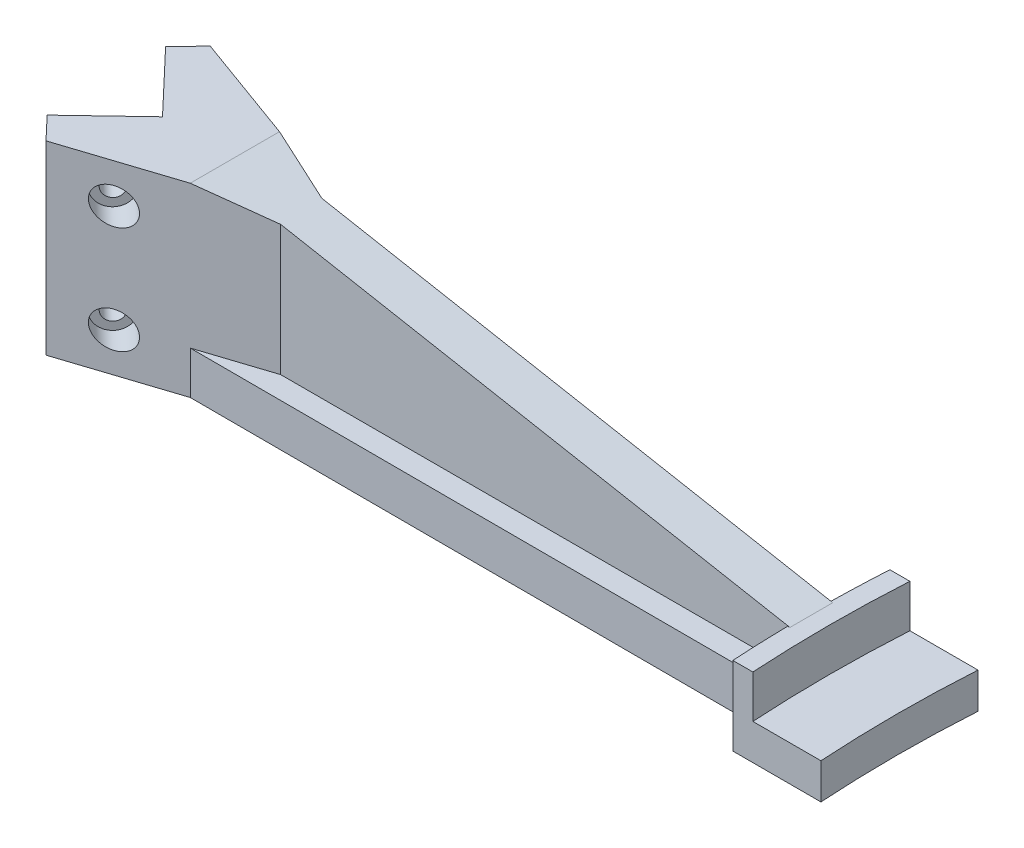
ISO-10303-21;
HEADER;
FILE_DESCRIPTION(('STEP AP214'),'2;1');
FILE_NAME('part.step','',(''),(''),'','','');
FILE_SCHEMA(('AUTOMOTIVE_DESIGN { 1 0 10303 214 1 1 1 1 }'));
ENDSEC;
DATA;
#1=APPLICATION_CONTEXT('core data for automotive mechanical design processes');
#2=APPLICATION_PROTOCOL_DEFINITION('international standard','automotive_design',2000,#1);
#3=PRODUCT_CONTEXT('',#1,'mechanical');
#4=PRODUCT('Part','Part','',(#3));
#5=PRODUCT_RELATED_PRODUCT_CATEGORY('part','',(#4));
#6=PRODUCT_DEFINITION_FORMATION('','',#4);
#7=PRODUCT_DEFINITION_CONTEXT('part definition',#1,'design');
#8=PRODUCT_DEFINITION('design','',#6,#7);
#9=PRODUCT_DEFINITION_SHAPE('','',#8);
#10=(LENGTH_UNIT() NAMED_UNIT(*) SI_UNIT(.MILLI.,.METRE.));
#11=(NAMED_UNIT(*) PLANE_ANGLE_UNIT() SI_UNIT($,.RADIAN.));
#12=(NAMED_UNIT(*) SI_UNIT($,.STERADIAN.) SOLID_ANGLE_UNIT());
#13=UNCERTAINTY_MEASURE_WITH_UNIT(LENGTH_MEASURE(1.E-05),#10,'distance_accuracy_value','');
#14=(GEOMETRIC_REPRESENTATION_CONTEXT(3) GLOBAL_UNCERTAINTY_ASSIGNED_CONTEXT((#13)) GLOBAL_UNIT_ASSIGNED_CONTEXT((#10,
#11,#12)) REPRESENTATION_CONTEXT('',''));
#15=CARTESIAN_POINT('',(0.,0.,0.));
#16=DIRECTION('',(0.,0.,1.));
#17=DIRECTION('',(1.,0.,0.));
#18=AXIS2_PLACEMENT_3D('',#15,#16,#17);
#19=CARTESIAN_POINT('',(-14.677433010329,-12.,40.4115677614171));
#20=DIRECTION('',(0.341379794654496,0.,-0.939925441618458));
#21=DIRECTION('',(0.939925441618459,0.,0.341379794654496));
#22=AXIS2_PLACEMENT_3D('',#19,#20,#21);
#23=PLANE('',#22);
#24=CARTESIAN_POINT('',(-176.366171619887,29.,-18.3135884482406));
#25=DIRECTION('',(-0.341379794654496,0.,0.939925441618458));
#26=DIRECTION('',(-0.939925441618459,0.,-0.341379794654496));
#27=AXIS2_PLACEMENT_3D('',#24,#25,#26);
#28=ELLIPSE('',#27,5.58738315295416,4.99999999999998);
#29=CARTESIAN_POINT('',(-181.617895197419,29.,-20.2210081616521));
#30=VERTEX_POINT('',#29);
#31=EDGE_CURVE('E194',#30,#30,#28,.T.);
#32=ORIENTED_EDGE('',*,*,#31,.T.);
#33=EDGE_LOOP('',(#32));
#34=FACE_BOUND('',#33,.T.);
#35=CARTESIAN_POINT('',(-176.366171619887,-0.999999999999997,-18.3135884482406));
#36=DIRECTION('',(-0.341379794654496,0.,0.939925441618458));
#37=DIRECTION('',(-0.939925441618459,0.,-0.341379794654496));
#38=AXIS2_PLACEMENT_3D('',#35,#36,#37);
#39=ELLIPSE('',#38,5.58738315295416,4.99999999999998);
#40=CARTESIAN_POINT('',(-181.617895197419,-0.999999999999997,-20.2210081616521));
#41=VERTEX_POINT('',#40);
#42=EDGE_CURVE('E329',#41,#41,#39,.T.);
#43=ORIENTED_EDGE('',*,*,#42,.T.);
#44=EDGE_LOOP('',(#43));
#45=FACE_BOUND('',#44,.T.);
#46=DIRECTION('',(0.,1.,0.));
#47=VECTOR('',#46,1.);
#48=CARTESIAN_POINT('',(-142.463007925521,-12.,-6.));
#49=LINE('',#48,#47);
#50=CARTESIAN_POINT('',(-142.463007925521,0.,-6.));
#51=VERTEX_POINT('',#50);
#52=CARTESIAN_POINT('',(-142.463007925521,36.5394166426613,-6.));
#53=VERTEX_POINT('',#52);
#54=EDGE_CURVE('E392',#51,#53,#49,.T.);
#55=ORIENTED_EDGE('',*,*,#54,.F.);
#56=DIRECTION('',(0.939925441618459,0.,0.341379794654496));
#57=VECTOR('',#56,1.);
#58=CARTESIAN_POINT('',(-14.677433010329,0.,40.4115677614171));
#59=LINE('',#58,#57);
#60=CARTESIAN_POINT('',(-161.12456554,0.,-12.7778553747776));
#61=VERTEX_POINT('',#60);
#62=EDGE_CURVE('E213',#61,#51,#59,.T.);
#63=ORIENTED_EDGE('',*,*,#62,.F.);
#64=DIRECTION('',(0.,1.,0.));
#65=VECTOR('',#64,1.);
#66=CARTESIAN_POINT('',(-161.12456554,-12.,-12.7778553747776));
#67=LINE('',#66,#65);
#68=CARTESIAN_POINT('',(-161.12456554,-12.,-12.7778553747776));
#69=VERTEX_POINT('',#68);
#70=EDGE_CURVE('E298',#69,#61,#67,.T.);
#71=ORIENTED_EDGE('',*,*,#70,.F.);
#72=DIRECTION('',(0.939925441618459,0.,0.341379794654496));
#73=VECTOR('',#72,1.);
#74=CARTESIAN_POINT('',(-14.677433010329,-12.,40.4115677614171));
#75=LINE('',#74,#73);
#76=CARTESIAN_POINT('',(-191.610767905309,-12.,-23.8504075607723));
#77=VERTEX_POINT('',#76);
#78=EDGE_CURVE('E290',#77,#69,#75,.T.);
#79=ORIENTED_EDGE('',*,*,#78,.F.);
#80=DIRECTION('',(0.,1.,0.));
#81=VECTOR('',#80,1.);
#82=CARTESIAN_POINT('',(-191.610767905309,-12.,-23.8504075607723));
#83=LINE('',#82,#81);
#84=CARTESIAN_POINT('',(-191.610767905309,40.,-23.8504075607723));
#85=VERTEX_POINT('',#84);
#86=EDGE_CURVE('E207',#77,#85,#83,.T.);
#87=ORIENTED_EDGE('',*,*,#86,.T.);
#88=DIRECTION('',(0.939925441618459,0.,0.341379794654496));
#89=VECTOR('',#88,1.);
#90=CARTESIAN_POINT('',(-14.677433010329,40.,40.4115677614171));
#91=LINE('',#90,#89);
#92=CARTESIAN_POINT('',(-161.12456554,40.,-12.7778553747775));
#93=VERTEX_POINT('',#92);
#94=EDGE_CURVE('E188',#85,#93,#91,.T.);
#95=ORIENTED_EDGE('',*,*,#94,.T.);
#96=DIRECTION('',(-0.925965204122098,0.171710199172954,-0.336309453115885));
#97=VECTOR('',#96,1.);
#98=CARTESIAN_POINT('',(-10.72745892573,12.1104885833626,41.8461936180905));
#99=LINE('',#98,#97);
#100=EDGE_CURVE('E193',#53,#93,#99,.T.);
#101=ORIENTED_EDGE('',*,*,#100,.F.);
#102=EDGE_LOOP('',(#55,#63,#71,#79,#87,#95,#101));
#103=FACE_BOUND('',#102,.T.);
#104=ADVANCED_FACE('F40',(#34,#45,#103),#23,.T.);
#105=CARTESIAN_POINT('',(-11.8491370737928,-12.,-36.3875184693806));
#106=DIRECTION('',(-0.309634199461379,0.,-0.950855752742713));
#107=DIRECTION('',(0.950855752742713,0.,-0.309634199461379));
#108=AXIS2_PLACEMENT_3D('',#105,#106,#107);
#109=PLANE('',#108);
#110=CARTESIAN_POINT('',(-177.25059753382,29.,17.4733838300045));
#111=DIRECTION('',(0.309634199461379,0.,0.950855752742713));
#112=DIRECTION('',(-0.950855752742713,0.,0.309634199461379));
#113=AXIS2_PLACEMENT_3D('',#110,#111,#112);
#114=ELLIPSE('',#113,5.68578526215447,4.99999999999998);
#115=CARTESIAN_POINT('',(-182.656959159199,29.,19.233897397961));
#116=VERTEX_POINT('',#115);
#117=EDGE_CURVE('E339',#116,#116,#114,.F.);
#118=ORIENTED_EDGE('',*,*,#117,.T.);
#119=EDGE_LOOP('',(#118));
#120=FACE_BOUND('',#119,.T.);
#121=CARTESIAN_POINT('',(-177.25059753382,-0.999999999999997,17.4733838300045));
#122=DIRECTION('',(0.309634199461379,0.,0.950855752742713));
#123=DIRECTION('',(-0.950855752742713,0.,0.309634199461379));
#124=AXIS2_PLACEMENT_3D('',#121,#122,#123);
#125=ELLIPSE('',#124,5.68578526215447,4.99999999999998);
#126=CARTESIAN_POINT('',(-182.656959159199,-0.999999999999997,19.233897397961));
#127=VERTEX_POINT('',#126);
#128=EDGE_CURVE('E344',#127,#127,#125,.F.);
#129=ORIENTED_EDGE('',*,*,#128,.T.);
#130=EDGE_LOOP('',(#129));
#131=FACE_BOUND('',#130,.T.);
#132=DIRECTION('',(-0.936410293348021,0.173647127627045,0.304930217556));
#133=VECTOR('',#132,1.);
#134=CARTESIAN_POINT('',(-7.89482977141085,11.5852082444189,-37.6751888362745));
#135=LINE('',#134,#133);
#136=CARTESIAN_POINT('',(-142.016979809542,36.4567055685404,6.));
#137=VERTEX_POINT('',#136);
#138=CARTESIAN_POINT('',(-161.12456554,40.,12.2221446252225));
#139=VERTEX_POINT('',#138);
#140=EDGE_CURVE('E203',#137,#139,#135,.T.);
#141=ORIENTED_EDGE('',*,*,#140,.T.);
#142=DIRECTION('',(0.950855752742713,0.,-0.309634199461379));
#143=VECTOR('',#142,1.);
#144=CARTESIAN_POINT('',(-11.8491370737928,40.,-36.3875184693806));
#145=LINE('',#144,#143);
#146=CARTESIAN_POINT('',(-191.610767905309,40.,22.1495924392277));
#147=VERTEX_POINT('',#146);
#148=EDGE_CURVE('E191',#147,#139,#145,.T.);
#149=ORIENTED_EDGE('',*,*,#148,.F.);
#150=DIRECTION('',(0.,1.,0.));
#151=VECTOR('',#150,1.);
#152=CARTESIAN_POINT('',(-191.610767905309,-12.,22.1495924392277));
#153=LINE('',#152,#151);
#154=CARTESIAN_POINT('',(-191.610767905309,-12.,22.1495924392277));
#155=VERTEX_POINT('',#154);
#156=EDGE_CURVE('E308',#155,#147,#153,.T.);
#157=ORIENTED_EDGE('',*,*,#156,.F.);
#158=DIRECTION('',(0.950855752742713,0.,-0.309634199461379));
#159=VECTOR('',#158,1.);
#160=CARTESIAN_POINT('',(-11.8491370737928,-12.,-36.3875184693806));
#161=LINE('',#160,#159);
#162=CARTESIAN_POINT('',(-161.12456554,-12.,12.2221446252224));
#163=VERTEX_POINT('',#162);
#164=EDGE_CURVE('E278',#155,#163,#161,.T.);
#165=ORIENTED_EDGE('',*,*,#164,.T.);
#166=DIRECTION('',(0.,1.,0.));
#167=VECTOR('',#166,1.);
#168=CARTESIAN_POINT('',(-161.12456554,-12.,12.2221446252224));
#169=LINE('',#168,#167);
#170=CARTESIAN_POINT('',(-161.12456554,0.,12.2221446252224));
#171=VERTEX_POINT('',#170);
#172=EDGE_CURVE('E311',#163,#171,#169,.T.);
#173=ORIENTED_EDGE('',*,*,#172,.T.);
#174=DIRECTION('',(0.950855752742713,0.,-0.309634199461379));
#175=VECTOR('',#174,1.);
#176=CARTESIAN_POINT('',(-11.8491370737928,0.,-36.3875184693806));
#177=LINE('',#176,#175);
#178=CARTESIAN_POINT('',(-142.016979809542,0.,6.));
#179=VERTEX_POINT('',#178);
#180=EDGE_CURVE('E208',#171,#179,#177,.T.);
#181=ORIENTED_EDGE('',*,*,#180,.T.);
#182=DIRECTION('',(0.,-1.,0.));
#183=VECTOR('',#182,1.);
#184=CARTESIAN_POINT('',(-142.016979809542,-12.,6.));
#185=LINE('',#184,#183);
#186=EDGE_CURVE('E216',#137,#179,#185,.T.);
#187=ORIENTED_EDGE('',*,*,#186,.F.);
#188=EDGE_LOOP('',(#141,#149,#157,#165,#173,#181,#187));
#189=FACE_BOUND('',#188,.T.);
#190=ADVANCED_FACE('F407',(#120,#131,#189),#109,.F.);
#191=CARTESIAN_POINT('',(0.,40.,0.));
#192=DIRECTION('',(0.,1.,0.));
#193=DIRECTION('',(0.,0.,-1.));
#194=AXIS2_PLACEMENT_3D('',#191,#192,#193);
#195=PLANE('',#194);
#196=ORIENTED_EDGE('',*,*,#94,.F.);
#197=DIRECTION('',(0.688749461914691,0.,-0.724999433594415));
#198=VECTOR('',#197,1.);
#199=CARTESIAN_POINT('',(-112.624785854425,40.,-106.993546561703));
#200=LINE('',#199,#198);
#201=CARTESIAN_POINT('',(-197.696610314021,40.,-17.4442576568645));
#202=VERTEX_POINT('',#201);
#203=EDGE_CURVE('E226',#202,#85,#200,.T.);
#204=ORIENTED_EDGE('',*,*,#203,.F.);
#205=DIRECTION('',(-0.688749461914691,0.,-0.724999433594416));
#206=VECTOR('',#205,1.);
#207=CARTESIAN_POINT('',(-95.2034510065709,40.,90.4432784562417));
#208=LINE('',#207,#206);
#209=CARTESIAN_POINT('',(-181.12456554,40.,0.));
#210=VERTEX_POINT('',#209);
#211=EDGE_CURVE('E223',#210,#202,#208,.T.);
#212=ORIENTED_EDGE('',*,*,#211,.F.);
#213=DIRECTION('',(-0.724999433594415,0.,0.688749461914691));
#214=VECTOR('',#213,1.);
#215=CARTESIAN_POINT('',(-85.9211145334293,40.,-90.4432784562418));
#216=LINE('',#215,#214);
#217=CARTESIAN_POINT('',(-197.696610314021,40.,15.74344253532));
#218=VERTEX_POINT('',#217);
#219=EDGE_CURVE('E220',#210,#218,#216,.T.);
#220=ORIENTED_EDGE('',*,*,#219,.T.);
#221=DIRECTION('',(0.688749461914691,0.,0.724999433594415));
#222=VECTOR('',#221,1.);
#223=CARTESIAN_POINT('',(-111.775495780592,40.,106.186720991562));
#224=LINE('',#223,#222);
#225=EDGE_CURVE('E210',#218,#147,#224,.T.);
#226=ORIENTED_EDGE('',*,*,#225,.T.);
#227=ORIENTED_EDGE('',*,*,#148,.T.);
#228=DIRECTION('',(0.,0.,-1.));
#229=VECTOR('',#228,1.);
#230=CARTESIAN_POINT('',(-161.12456554,40.,22.1495924392277));
#231=LINE('',#230,#229);
#232=EDGE_CURVE('E57',#139,#93,#231,.T.);
#233=ORIENTED_EDGE('',*,*,#232,.T.);
#234=EDGE_LOOP('',(#196,#204,#212,#220,#226,#227,#233));
#235=FACE_BOUND('',#234,.T.);
#236=ADVANCED_FACE('F185',(#235),#195,.T.);
#237=CARTESIAN_POINT('',(0.,0.,0.));
#238=DIRECTION('',(0.,1.,0.));
#239=DIRECTION('',(0.,0.,-1.));
#240=AXIS2_PLACEMENT_3D('',#237,#238,#239);
#241=PLANE('',#240);
#242=CARTESIAN_POINT('',(370.6,0.,0.));
#243=DIRECTION('',(0.,-1.,0.));
#244=DIRECTION('',(0.,0.,-1.));
#245=AXIS2_PLACEMENT_3D('',#242,#243,#244);
#246=CIRCLE('',#245,370.6);
#247=CARTESIAN_POINT('',(0.210866790074399,0.,-12.5));
#248=VERTEX_POINT('',#247);
#249=CARTESIAN_POINT('',(0.0485730698099318,0.,-6.));
#250=VERTEX_POINT('',#249);
#251=EDGE_CURVE('E11',#248,#250,#246,.F.);
#252=ORIENTED_EDGE('',*,*,#251,.F.);
#253=DIRECTION('',(0.99999851697959,0.,0.00172221909781054));
#254=VECTOR('',#253,1.);
#255=CARTESIAN_POINT('',(0.021528332235599,0.,-12.5003260827916));
#256=LINE('',#255,#254);
#257=EDGE_CURVE('E261',#61,#248,#256,.T.);
#258=ORIENTED_EDGE('',*,*,#257,.F.);
#259=ORIENTED_EDGE('',*,*,#62,.T.);
#260=DIRECTION('',(1.,0.,0.));
#261=VECTOR('',#260,1.);
#262=CARTESIAN_POINT('',(-161.12456554,0.,-6.));
#263=LINE('',#262,#261);
#264=EDGE_CURVE('E379',#51,#250,#263,.T.);
#265=ORIENTED_EDGE('',*,*,#264,.T.);
#266=EDGE_LOOP('',(#252,#258,#259,#265));
#267=FACE_BOUND('',#266,.T.);
#268=ADVANCED_FACE('F469',(#267),#241,.T.);
#269=CARTESIAN_POINT('',(370.6,-12.,0.));
#270=DIRECTION('',(0.,1.,0.));
#271=DIRECTION('',(0.,0.,-1.));
#272=AXIS2_PLACEMENT_3D('',#269,#270,#271);
#273=CYLINDRICAL_SURFACE('',#272,370.6);
#274=CARTESIAN_POINT('',(370.6,10.,0.));
#275=DIRECTION('',(0.,-1.,0.));
#276=DIRECTION('',(0.,0.,-1.));
#277=AXIS2_PLACEMENT_3D('',#274,#275,#276);
#278=CIRCLE('',#277,370.6);
#279=CARTESIAN_POINT('',(0.0485730698099318,10.,-6.));
#280=VERTEX_POINT('',#279);
#281=CARTESIAN_POINT('',(0.653571445810575,10.,-21.9999999999998));
#282=VERTEX_POINT('',#281);
#283=EDGE_CURVE('E238',#280,#282,#278,.T.);
#284=ORIENTED_EDGE('',*,*,#283,.T.);
#285=DIRECTION('',(0.,1.,0.));
#286=VECTOR('',#285,1.);
#287=CARTESIAN_POINT('',(0.653571445810575,-12.,-22.));
#288=LINE('',#287,#286);
#289=CARTESIAN_POINT('',(0.653571445810575,-12.,-22.));
#290=VERTEX_POINT('',#289);
#291=EDGE_CURVE('E325',#290,#282,#288,.T.);
#292=ORIENTED_EDGE('',*,*,#291,.F.);
#293=CARTESIAN_POINT('',(370.6,-12.,0.));
#294=DIRECTION('',(0.,-1.,0.));
#295=DIRECTION('',(0.,0.,-1.));
#296=AXIS2_PLACEMENT_3D('',#293,#294,#295);
#297=CIRCLE('',#296,370.6);
#298=CARTESIAN_POINT('',(0.210866790074399,-12.,-12.5));
#299=VERTEX_POINT('',#298);
#300=EDGE_CURVE('E264',#299,#290,#297,.T.);
#301=ORIENTED_EDGE('',*,*,#300,.F.);
#302=DIRECTION('',(0.,1.,0.));
#303=VECTOR('',#302,1.);
#304=CARTESIAN_POINT('',(0.210866790074399,-12.,-12.5));
#305=LINE('',#304,#303);
#306=EDGE_CURVE('E293',#299,#248,#305,.T.);
#307=ORIENTED_EDGE('',*,*,#306,.T.);
#308=ORIENTED_EDGE('',*,*,#251,.T.);
#309=DIRECTION('',(0.,1.,0.));
#310=VECTOR('',#309,1.);
#311=CARTESIAN_POINT('',(0.0485730698099318,-12.,-6.));
#312=LINE('',#311,#310);
#313=EDGE_CURVE('E390',#280,#250,#312,.F.);
#314=ORIENTED_EDGE('',*,*,#313,.F.);
#315=EDGE_LOOP('',(#284,#292,#301,#307,#308,#314));
#316=FACE_BOUND('',#315,.T.);
#317=ADVANCED_FACE('F454',(#316),#273,.T.);
#318=DIRECTION('',(1.,0.,0.));
#319=VECTOR('',#318,1.);
#320=CARTESIAN_POINT('',(-161.12456554,0.,6.));
#321=LINE('',#320,#319);
#322=CARTESIAN_POINT('',(0.0485730698099318,0.,6.));
#323=VERTEX_POINT('',#322);
#324=EDGE_CURVE('E384',#179,#323,#321,.T.);
#325=ORIENTED_EDGE('',*,*,#324,.F.);
#326=ORIENTED_EDGE('',*,*,#180,.F.);
#327=DIRECTION('',(0.99999851697959,0.,0.00172221909781055));
#328=VECTOR('',#327,1.);
#329=CARTESIAN_POINT('',(-0.0215270813575127,0.,12.4995997662429));
#330=LINE('',#329,#328);
#331=CARTESIAN_POINT('',(0.210866790074427,0.,12.5));
#332=VERTEX_POINT('',#331);
#333=EDGE_CURVE('E265',#171,#332,#330,.T.);
#334=ORIENTED_EDGE('',*,*,#333,.T.);
#335=EDGE_CURVE('E49',#323,#332,#246,.F.);
#336=ORIENTED_EDGE('',*,*,#335,.F.);
#337=EDGE_LOOP('',(#325,#326,#334,#336));
#338=FACE_BOUND('',#337,.T.);
#339=ADVANCED_FACE('F410',(#338),#241,.T.);
#340=CARTESIAN_POINT('',(0.021528332235599,-12.,-12.5003260827916));
#341=DIRECTION('',(0.00172221909781054,0.,-0.99999851697959));
#342=DIRECTION('',(0.99999851697959,0.,0.00172221909781054));
#343=AXIS2_PLACEMENT_3D('',#340,#341,#342);
#344=PLANE('',#343);
#345=ORIENTED_EDGE('',*,*,#257,.T.);
#346=ORIENTED_EDGE('',*,*,#306,.F.);
#347=DIRECTION('',(0.99999851697959,0.,0.00172221909781054));
#348=VECTOR('',#347,1.);
#349=CARTESIAN_POINT('',(0.021528332235599,-12.,-12.5003260827916));
#350=LINE('',#349,#348);
#351=EDGE_CURVE('E262',#69,#299,#350,.T.);
#352=ORIENTED_EDGE('',*,*,#351,.F.);
#353=ORIENTED_EDGE('',*,*,#70,.T.);
#354=EDGE_LOOP('',(#345,#346,#352,#353));
#355=FACE_BOUND('',#354,.T.);
#356=ADVANCED_FACE('F42',(#355),#344,.T.);
#357=CARTESIAN_POINT('',(-112.624785854425,-12.,-106.993546561703));
#358=DIRECTION('',(-0.724999433594415,0.,-0.688749461914691));
#359=DIRECTION('',(0.688749461914691,0.,-0.724999433594415));
#360=AXIS2_PLACEMENT_3D('',#357,#358,#359);
#361=PLANE('',#360);
#362=ORIENTED_EDGE('',*,*,#86,.F.);
#363=DIRECTION('',(0.688749461914691,0.,-0.724999433594415));
#364=VECTOR('',#363,1.);
#365=CARTESIAN_POINT('',(-112.624785854425,-12.,-106.993546561703));
#366=LINE('',#365,#364);
#367=CARTESIAN_POINT('',(-197.696610314021,-12.,-17.4442576568645));
#368=VERTEX_POINT('',#367);
#369=EDGE_CURVE('E288',#368,#77,#366,.T.);
#370=ORIENTED_EDGE('',*,*,#369,.F.);
#371=DIRECTION('',(0.,1.,0.));
#372=VECTOR('',#371,1.);
#373=CARTESIAN_POINT('',(-197.696610314021,-12.,-17.4442576568645));
#374=LINE('',#373,#372);
#375=EDGE_CURVE('E302',#368,#202,#374,.T.);
#376=ORIENTED_EDGE('',*,*,#375,.T.);
#377=ORIENTED_EDGE('',*,*,#203,.T.);
#378=EDGE_LOOP('',(#362,#370,#376,#377));
#379=FACE_BOUND('',#378,.T.);
#380=ADVANCED_FACE('F444',(#379),#361,.T.);
#381=CARTESIAN_POINT('',(-95.2034510065709,-12.,90.4432784562417));
#382=DIRECTION('',(-0.724999433594416,0.,0.688749461914691));
#383=DIRECTION('',(-0.688749461914691,0.,-0.724999433594416));
#384=AXIS2_PLACEMENT_3D('',#381,#382,#383);
#385=PLANE('',#384);
#386=CARTESIAN_POINT('',(-188.012060159147,29.,-7.24999433594418));
#387=DIRECTION('',(0.724999433594416,0.,-0.688749461914691));
#388=DIRECTION('',(-0.688749461914691,0.,-0.724999433594416));
#389=AXIS2_PLACEMENT_3D('',#386,#387,#388);
#390=CIRCLE('',#389,2.75000000000001);
#391=CARTESIAN_POINT('',(-189.906121179412,29.,-9.24374277832884));
#392=VERTEX_POINT('',#391);
#393=EDGE_CURVE('E338',#392,#392,#390,.T.);
#394=ORIENTED_EDGE('',*,*,#393,.T.);
#395=EDGE_LOOP('',(#394));
#396=FACE_BOUND('',#395,.T.);
#397=CARTESIAN_POINT('',(-188.012060159147,-0.999999999999997,-7.24999433594418));
#398=DIRECTION('',(0.724999433594416,0.,-0.688749461914691));
#399=DIRECTION('',(-0.688749461914691,0.,-0.724999433594416));
#400=AXIS2_PLACEMENT_3D('',#397,#398,#399);
#401=CIRCLE('',#400,2.75000000000001);
#402=CARTESIAN_POINT('',(-189.906121179412,-0.999999999999997,-9.24374277832884));
#403=VERTEX_POINT('',#402);
#404=EDGE_CURVE('E343',#403,#403,#401,.T.);
#405=ORIENTED_EDGE('',*,*,#404,.T.);
#406=EDGE_LOOP('',(#405));
#407=FACE_BOUND('',#406,.T.);
#408=ORIENTED_EDGE('',*,*,#375,.F.);
#409=DIRECTION('',(-0.688749461914691,0.,-0.724999433594416));
#410=VECTOR('',#409,1.);
#411=CARTESIAN_POINT('',(-95.2034510065709,-12.,90.4432784562417));
#412=LINE('',#411,#410);
#413=CARTESIAN_POINT('',(-181.12456554,-12.,0.));
#414=VERTEX_POINT('',#413);
#415=EDGE_CURVE('E286',#414,#368,#412,.T.);
#416=ORIENTED_EDGE('',*,*,#415,.F.);
#417=DIRECTION('',(0.,1.,0.));
#418=VECTOR('',#417,1.);
#419=CARTESIAN_POINT('',(-181.12456554,-12.,0.));
#420=LINE('',#419,#418);
#421=EDGE_CURVE('E304',#414,#210,#420,.T.);
#422=ORIENTED_EDGE('',*,*,#421,.T.);
#423=ORIENTED_EDGE('',*,*,#211,.T.);
#424=EDGE_LOOP('',(#408,#416,#422,#423));
#425=FACE_BOUND('',#424,.T.);
#426=ADVANCED_FACE('F441',(#396,#407,#425),#385,.T.);
#427=CARTESIAN_POINT('',(-85.9211145334293,-12.,-90.4432784562418));
#428=DIRECTION('',(0.688749461914691,0.,0.724999433594415));
#429=DIRECTION('',(-0.724999433594415,0.,0.688749461914691));
#430=AXIS2_PLACEMENT_3D('',#427,#428,#429);
#431=PLANE('',#430);
#432=CARTESIAN_POINT('',(-188.384099342176,29.,6.89655711206684));
#433=DIRECTION('',(-0.688749461914691,0.,-0.724999433594415));
#434=DIRECTION('',(-0.724999433594415,0.,0.688749461914691));
#435=AXIS2_PLACEMENT_3D('',#432,#433,#434);
#436=ELLIPSE('',#435,2.75361842105264,2.75000000000001);
#437=CARTESIAN_POINT('',(-190.380471137774,29.,8.79311031788523));
#438=VERTEX_POINT('',#437);
#439=EDGE_CURVE('E351',#438,#438,#436,.F.);
#440=ORIENTED_EDGE('',*,*,#439,.T.);
#441=EDGE_LOOP('',(#440));
#442=FACE_BOUND('',#441,.T.);
#443=CARTESIAN_POINT('',(-188.384099342176,-0.999999999999997,6.89655711206684));
#444=DIRECTION('',(-0.688749461914691,0.,-0.724999433594415));
#445=DIRECTION('',(-0.724999433594415,0.,0.688749461914691));
#446=AXIS2_PLACEMENT_3D('',#443,#444,#445);
#447=ELLIPSE('',#446,2.75361842105264,2.75000000000001);
#448=CARTESIAN_POINT('',(-190.380471137774,-0.999999999999997,8.79311031788523));
#449=VERTEX_POINT('',#448);
#450=EDGE_CURVE('E359',#449,#449,#447,.F.);
#451=ORIENTED_EDGE('',*,*,#450,.T.);
#452=EDGE_LOOP('',(#451));
#453=FACE_BOUND('',#452,.T.);
#454=ORIENTED_EDGE('',*,*,#421,.F.);
#455=DIRECTION('',(-0.724999433594415,0.,0.688749461914691));
#456=VECTOR('',#455,1.);
#457=CARTESIAN_POINT('',(-85.9211145334293,-12.,-90.4432784562418));
#458=LINE('',#457,#456);
#459=CARTESIAN_POINT('',(-197.696610314021,-12.,15.74344253532));
#460=VERTEX_POINT('',#459);
#461=EDGE_CURVE('E283',#414,#460,#458,.T.);
#462=ORIENTED_EDGE('',*,*,#461,.T.);
#463=DIRECTION('',(0.,1.,0.));
#464=VECTOR('',#463,1.);
#465=CARTESIAN_POINT('',(-197.696610314021,-12.,15.74344253532));
#466=LINE('',#465,#464);
#467=EDGE_CURVE('E306',#460,#218,#466,.T.);
#468=ORIENTED_EDGE('',*,*,#467,.T.);
#469=ORIENTED_EDGE('',*,*,#219,.F.);
#470=EDGE_LOOP('',(#454,#462,#468,#469));
#471=FACE_BOUND('',#470,.T.);
#472=ADVANCED_FACE('F438',(#442,#453,#471),#431,.F.);
#473=CARTESIAN_POINT('',(-111.775495780592,-12.,106.186720991562));
#474=DIRECTION('',(0.724999433594415,0.,-0.688749461914691));
#475=DIRECTION('',(0.688749461914691,0.,0.724999433594415));
#476=AXIS2_PLACEMENT_3D('',#473,#474,#475);
#477=PLANE('',#476);
#478=ORIENTED_EDGE('',*,*,#467,.F.);
#479=DIRECTION('',(0.688749461914691,0.,0.724999433594415));
#480=VECTOR('',#479,1.);
#481=CARTESIAN_POINT('',(-111.775495780592,-12.,106.186720991562));
#482=LINE('',#481,#480);
#483=EDGE_CURVE('E281',#460,#155,#482,.T.);
#484=ORIENTED_EDGE('',*,*,#483,.T.);
#485=ORIENTED_EDGE('',*,*,#156,.T.);
#486=ORIENTED_EDGE('',*,*,#225,.F.);
#487=EDGE_LOOP('',(#478,#484,#485,#486));
#488=FACE_BOUND('',#487,.T.);
#489=ADVANCED_FACE('F432',(#488),#477,.F.);
#490=CARTESIAN_POINT('',(-0.0215270813575127,-12.,12.4995997662429));
#491=DIRECTION('',(0.00172221909781055,0.,-0.99999851697959));
#492=DIRECTION('',(0.99999851697959,0.,0.00172221909781055));
#493=AXIS2_PLACEMENT_3D('',#490,#491,#492);
#494=PLANE('',#493);
#495=ORIENTED_EDGE('',*,*,#333,.F.);
#496=ORIENTED_EDGE('',*,*,#172,.F.);
#497=DIRECTION('',(0.99999851697959,0.,0.00172221909781055));
#498=VECTOR('',#497,1.);
#499=CARTESIAN_POINT('',(-0.0215270813575127,-12.,12.4995997662429));
#500=LINE('',#499,#498);
#501=CARTESIAN_POINT('',(0.210866790074399,-12.,12.5));
#502=VERTEX_POINT('',#501);
#503=EDGE_CURVE('E275',#163,#502,#500,.T.);
#504=ORIENTED_EDGE('',*,*,#503,.T.);
#505=DIRECTION('',(0.,1.,0.));
#506=VECTOR('',#505,1.);
#507=CARTESIAN_POINT('',(0.210866790074399,-12.,12.5));
#508=LINE('',#507,#506);
#509=EDGE_CURVE('E314',#502,#332,#508,.T.);
#510=ORIENTED_EDGE('',*,*,#509,.T.);
#511=EDGE_LOOP('',(#495,#496,#504,#510));
#512=FACE_BOUND('',#511,.T.);
#513=ADVANCED_FACE('F415',(#512),#494,.F.);
#514=DIRECTION('',(0.,1.,0.));
#515=VECTOR('',#514,1.);
#516=CARTESIAN_POINT('',(0.0485730698099318,-12.,6.));
#517=LINE('',#516,#515);
#518=CARTESIAN_POINT('',(0.0485730698099318,10.,6.));
#519=VERTEX_POINT('',#518);
#520=EDGE_CURVE('E395',#519,#323,#517,.F.);
#521=ORIENTED_EDGE('',*,*,#520,.T.);
#522=ORIENTED_EDGE('',*,*,#335,.T.);
#523=ORIENTED_EDGE('',*,*,#509,.F.);
#524=CARTESIAN_POINT('',(0.653571445810575,-12.,22.));
#525=VERTEX_POINT('',#524);
#526=EDGE_CURVE('E269',#525,#502,#297,.T.);
#527=ORIENTED_EDGE('',*,*,#526,.F.);
#528=DIRECTION('',(0.,1.,0.));
#529=VECTOR('',#528,1.);
#530=CARTESIAN_POINT('',(0.653571445810575,-12.,22.));
#531=LINE('',#530,#529);
#532=CARTESIAN_POINT('',(0.653571445810575,10.,22.));
#533=VERTEX_POINT('',#532);
#534=EDGE_CURVE('E316',#525,#533,#531,.T.);
#535=ORIENTED_EDGE('',*,*,#534,.T.);
#536=EDGE_CURVE('E239',#533,#519,#278,.T.);
#537=ORIENTED_EDGE('',*,*,#536,.T.);
#538=EDGE_LOOP('',(#521,#522,#523,#527,#535,#537));
#539=FACE_BOUND('',#538,.T.);
#540=ADVANCED_FACE('F412',(#539),#273,.T.);
#541=CARTESIAN_POINT('',(0.,-12.,22.));
#542=DIRECTION('',(0.,0.,-1.));
#543=DIRECTION('',(1.,0.,0.));
#544=AXIS2_PLACEMENT_3D('',#541,#542,#543);
#545=PLANE('',#544);
#546=DIRECTION('',(0.,-1.,0.));
#547=VECTOR('',#546,1.);
#548=CARTESIAN_POINT('',(25.3402114349254,-2.,22.));
#549=LINE('',#548,#547);
#550=CARTESIAN_POINT('',(25.3402114349254,-2.,22.));
#551=VERTEX_POINT('',#550);
#552=CARTESIAN_POINT('',(25.3402114349254,-12.,22.));
#553=VERTEX_POINT('',#552);
#554=EDGE_CURVE('E254',#551,#553,#549,.T.);
#555=ORIENTED_EDGE('',*,*,#554,.F.);
#556=DIRECTION('',(1.,0.,0.));
#557=VECTOR('',#556,1.);
#558=CARTESIAN_POINT('',(0.,-2.,22.));
#559=LINE('',#558,#557);
#560=CARTESIAN_POINT('',(6.26361696915306,-2.,22.));
#561=VERTEX_POINT('',#560);
#562=EDGE_CURVE('E248',#561,#551,#559,.T.);
#563=ORIENTED_EDGE('',*,*,#562,.F.);
#564=DIRECTION('',(0.,1.,0.));
#565=VECTOR('',#564,1.);
#566=CARTESIAN_POINT('',(6.26361696915312,-12.,22.));
#567=LINE('',#566,#565);
#568=CARTESIAN_POINT('',(6.26361696915306,10.,22.));
#569=VERTEX_POINT('',#568);
#570=EDGE_CURVE('E319',#561,#569,#567,.T.);
#571=ORIENTED_EDGE('',*,*,#570,.T.);
#572=DIRECTION('',(1.,0.,0.));
#573=VECTOR('',#572,1.);
#574=CARTESIAN_POINT('',(0.,10.,22.));
#575=LINE('',#574,#573);
#576=EDGE_CURVE('E235',#533,#569,#575,.T.);
#577=ORIENTED_EDGE('',*,*,#576,.F.);
#578=ORIENTED_EDGE('',*,*,#534,.F.);
#579=DIRECTION('',(1.,0.,0.));
#580=VECTOR('',#579,1.);
#581=CARTESIAN_POINT('',(0.,-12.,22.));
#582=LINE('',#581,#580);
#583=EDGE_CURVE('E272',#525,#553,#582,.T.);
#584=ORIENTED_EDGE('',*,*,#583,.T.);
#585=EDGE_LOOP('',(#555,#563,#571,#577,#578,#584));
#586=FACE_BOUND('',#585,.T.);
#587=ADVANCED_FACE('F423',(#586),#545,.F.);
#588=CARTESIAN_POINT('',(370.6,-12.,0.));
#589=DIRECTION('',(0.,1.,0.));
#590=DIRECTION('',(0.,0.,-1.));
#591=AXIS2_PLACEMENT_3D('',#588,#589,#590);
#592=CYLINDRICAL_SURFACE('',#591,365.);
#593=DIRECTION('',(0.,1.,0.));
#594=VECTOR('',#593,1.);
#595=CARTESIAN_POINT('',(6.26361696915312,-12.,-22.));
#596=LINE('',#595,#594);
#597=CARTESIAN_POINT('',(6.26361696915306,-2.,-21.9999999999999));
#598=VERTEX_POINT('',#597);
#599=CARTESIAN_POINT('',(6.26361696915306,10.,-21.9999999999999));
#600=VERTEX_POINT('',#599);
#601=EDGE_CURVE('E322',#598,#600,#596,.T.);
#602=ORIENTED_EDGE('',*,*,#601,.T.);
#603=CARTESIAN_POINT('',(370.6,10.,0.));
#604=DIRECTION('',(0.,-1.,0.));
#605=DIRECTION('',(0.,0.,-1.));
#606=AXIS2_PLACEMENT_3D('',#603,#604,#605);
#607=CIRCLE('',#606,365.);
#608=EDGE_CURVE('E232',#569,#600,#607,.T.);
#609=ORIENTED_EDGE('',*,*,#608,.F.);
#610=ORIENTED_EDGE('',*,*,#570,.F.);
#611=CARTESIAN_POINT('',(370.6,-2.,0.));
#612=DIRECTION('',(0.,-1.,0.));
#613=DIRECTION('',(0.,0.,-1.));
#614=AXIS2_PLACEMENT_3D('',#611,#612,#613);
#615=CIRCLE('',#614,365.);
#616=EDGE_CURVE('E251',#561,#598,#615,.T.);
#617=ORIENTED_EDGE('',*,*,#616,.T.);
#618=EDGE_LOOP('',(#602,#609,#610,#617));
#619=FACE_BOUND('',#618,.T.);
#620=ADVANCED_FACE('F466',(#619),#592,.F.);
#621=CARTESIAN_POINT('',(0.,-12.,-22.));
#622=DIRECTION('',(0.,0.,-1.));
#623=DIRECTION('',(1.,0.,0.));
#624=AXIS2_PLACEMENT_3D('',#621,#622,#623);
#625=PLANE('',#624);
#626=DIRECTION('',(1.,0.,0.));
#627=VECTOR('',#626,1.);
#628=CARTESIAN_POINT('',(0.,-2.,-22.));
#629=LINE('',#628,#627);
#630=CARTESIAN_POINT('',(25.3402114349254,-2.,-21.9999999999998));
#631=VERTEX_POINT('',#630);
#632=EDGE_CURVE('E243',#598,#631,#629,.T.);
#633=ORIENTED_EDGE('',*,*,#632,.T.);
#634=DIRECTION('',(0.,-1.,0.));
#635=VECTOR('',#634,1.);
#636=CARTESIAN_POINT('',(25.3402114349254,-2.,-21.9999999999998));
#637=LINE('',#636,#635);
#638=CARTESIAN_POINT('',(25.3402114349254,-12.,-21.9999999999998));
#639=VERTEX_POINT('',#638);
#640=EDGE_CURVE('E258',#631,#639,#637,.T.);
#641=ORIENTED_EDGE('',*,*,#640,.T.);
#642=DIRECTION('',(1.,0.,0.));
#643=VECTOR('',#642,1.);
#644=CARTESIAN_POINT('',(0.,-12.,-22.));
#645=LINE('',#644,#643);
#646=EDGE_CURVE('E268',#290,#639,#645,.T.);
#647=ORIENTED_EDGE('',*,*,#646,.F.);
#648=ORIENTED_EDGE('',*,*,#291,.T.);
#649=DIRECTION('',(1.,0.,0.));
#650=VECTOR('',#649,1.);
#651=CARTESIAN_POINT('',(0.,10.,-22.));
#652=LINE('',#651,#650);
#653=EDGE_CURVE('E228',#282,#600,#652,.T.);
#654=ORIENTED_EDGE('',*,*,#653,.T.);
#655=ORIENTED_EDGE('',*,*,#601,.F.);
#656=EDGE_LOOP('',(#633,#641,#647,#648,#654,#655));
#657=FACE_BOUND('',#656,.T.);
#658=ADVANCED_FACE('F457',(#657),#625,.T.);
#659=CARTESIAN_POINT('',(0.,-12.,0.));
#660=DIRECTION('',(0.,1.,0.));
#661=DIRECTION('',(0.,0.,-1.));
#662=AXIS2_PLACEMENT_3D('',#659,#660,#661);
#663=PLANE('',#662);
#664=CARTESIAN_POINT('',(370.6,-12.,0.));
#665=DIRECTION('',(0.,-1.,0.));
#666=DIRECTION('',(0.,0.,-1.));
#667=AXIS2_PLACEMENT_3D('',#664,#665,#666);
#668=CIRCLE('',#667,345.96);
#669=EDGE_CURVE('E242',#553,#639,#668,.T.);
#670=ORIENTED_EDGE('',*,*,#669,.F.);
#671=ORIENTED_EDGE('',*,*,#583,.F.);
#672=ORIENTED_EDGE('',*,*,#526,.T.);
#673=ORIENTED_EDGE('',*,*,#503,.F.);
#674=ORIENTED_EDGE('',*,*,#164,.F.);
#675=ORIENTED_EDGE('',*,*,#483,.F.);
#676=ORIENTED_EDGE('',*,*,#461,.F.);
#677=ORIENTED_EDGE('',*,*,#415,.T.);
#678=ORIENTED_EDGE('',*,*,#369,.T.);
#679=ORIENTED_EDGE('',*,*,#78,.T.);
#680=ORIENTED_EDGE('',*,*,#351,.T.);
#681=ORIENTED_EDGE('',*,*,#300,.T.);
#682=ORIENTED_EDGE('',*,*,#646,.T.);
#683=EDGE_LOOP('',(#670,#671,#672,#673,#674,#675,#676,#677,#678,#679,#680,#681,#682));
#684=FACE_BOUND('',#683,.T.);
#685=ADVANCED_FACE('F418',(#684),#663,.F.);
#686=CARTESIAN_POINT('',(370.6,-2.,0.));
#687=DIRECTION('',(0.,-1.,0.));
#688=DIRECTION('',(0.,0.,1.));
#689=AXIS2_PLACEMENT_3D('',#686,#687,#688);
#690=CYLINDRICAL_SURFACE('',#689,345.96);
#691=ORIENTED_EDGE('',*,*,#669,.T.);
#692=ORIENTED_EDGE('',*,*,#640,.F.);
#693=CARTESIAN_POINT('',(370.6,-2.,0.));
#694=DIRECTION('',(0.,-1.,0.));
#695=DIRECTION('',(0.,0.,-1.));
#696=AXIS2_PLACEMENT_3D('',#693,#694,#695);
#697=CIRCLE('',#696,345.96);
#698=EDGE_CURVE('E246',#551,#631,#697,.T.);
#699=ORIENTED_EDGE('',*,*,#698,.F.);
#700=ORIENTED_EDGE('',*,*,#554,.T.);
#701=EDGE_LOOP('',(#691,#692,#699,#700));
#702=FACE_BOUND('',#701,.T.);
#703=ADVANCED_FACE('F460',(#702),#690,.F.);
#704=CARTESIAN_POINT('',(370.6,-2.,0.));
#705=DIRECTION('',(0.,1.,0.));
#706=DIRECTION('',(0.,0.,-1.));
#707=AXIS2_PLACEMENT_3D('',#704,#705,#706);
#708=PLANE('',#707);
#709=ORIENTED_EDGE('',*,*,#632,.F.);
#710=ORIENTED_EDGE('',*,*,#616,.F.);
#711=ORIENTED_EDGE('',*,*,#562,.T.);
#712=ORIENTED_EDGE('',*,*,#698,.T.);
#713=EDGE_LOOP('',(#709,#710,#711,#712));
#714=FACE_BOUND('',#713,.T.);
#715=ADVANCED_FACE('F464',(#714),#708,.T.);
#716=CARTESIAN_POINT('',(370.6,10.,0.));
#717=DIRECTION('',(0.,1.,0.));
#718=DIRECTION('',(0.,0.,-1.));
#719=AXIS2_PLACEMENT_3D('',#716,#717,#718);
#720=PLANE('',#719);
#721=DIRECTION('',(0.,0.,-1.));
#722=VECTOR('',#721,1.);
#723=CARTESIAN_POINT('',(0.653571445810575,10.,6.));
#724=LINE('',#723,#722);
#725=CARTESIAN_POINT('',(0.653571445810575,10.,6.));
#726=VERTEX_POINT('',#725);
#727=CARTESIAN_POINT('',(0.653571445810575,10.,-6.));
#728=VERTEX_POINT('',#727);
#729=EDGE_CURVE('E387',#726,#728,#724,.T.);
#730=ORIENTED_EDGE('',*,*,#729,.F.);
#731=DIRECTION('',(-1.,0.,0.));
#732=VECTOR('',#731,1.);
#733=CARTESIAN_POINT('',(370.6,10.,6.));
#734=LINE('',#733,#732);
#735=EDGE_CURVE('E394',#726,#519,#734,.T.);
#736=ORIENTED_EDGE('',*,*,#735,.T.);
#737=ORIENTED_EDGE('',*,*,#536,.F.);
#738=ORIENTED_EDGE('',*,*,#576,.T.);
#739=ORIENTED_EDGE('',*,*,#608,.T.);
#740=ORIENTED_EDGE('',*,*,#653,.F.);
#741=ORIENTED_EDGE('',*,*,#283,.F.);
#742=DIRECTION('',(-1.,0.,0.));
#743=VECTOR('',#742,1.);
#744=CARTESIAN_POINT('',(370.6,10.,-6.));
#745=LINE('',#744,#743);
#746=EDGE_CURVE('E65',#728,#280,#745,.T.);
#747=ORIENTED_EDGE('',*,*,#746,.F.);
#748=EDGE_LOOP('',(#730,#736,#737,#738,#739,#740,#741,#747));
#749=FACE_BOUND('',#748,.T.);
#750=ADVANCED_FACE('F427',(#749),#720,.T.);
#751=CARTESIAN_POINT('',(0.,0.,6.));
#752=DIRECTION('',(0.,0.,1.));
#753=DIRECTION('',(-1.,0.,0.));
#754=AXIS2_PLACEMENT_3D('',#751,#752,#753);
#755=PLANE('',#754);
#756=ORIENTED_EDGE('',*,*,#186,.T.);
#757=ORIENTED_EDGE('',*,*,#324,.T.);
#758=ORIENTED_EDGE('',*,*,#520,.F.);
#759=ORIENTED_EDGE('',*,*,#735,.F.);
#760=DIRECTION('',(-0.983237266642298,0.182330681690667,0.));
#761=VECTOR('',#760,1.);
#762=CARTESIAN_POINT('',(0.653571445810575,10.,6.));
#763=LINE('',#762,#761);
#764=EDGE_CURVE('E382',#726,#137,#763,.T.);
#765=ORIENTED_EDGE('',*,*,#764,.T.);
#766=EDGE_LOOP('',(#756,#757,#758,#759,#765));
#767=FACE_BOUND('',#766,.T.);
#768=ADVANCED_FACE('F403',(#767),#755,.T.);
#769=CARTESIAN_POINT('',(0.653571445810575,10.,6.));
#770=DIRECTION('',(0.182330681690667,0.983237266642297,0.));
#771=DIRECTION('',(-0.983237266642298,0.182330681690667,0.));
#772=AXIS2_PLACEMENT_3D('',#769,#770,#771);
#773=PLANE('',#772);
#774=ORIENTED_EDGE('',*,*,#100,.T.);
#775=ORIENTED_EDGE('',*,*,#232,.F.);
#776=ORIENTED_EDGE('',*,*,#140,.F.);
#777=ORIENTED_EDGE('',*,*,#764,.F.);
#778=ORIENTED_EDGE('',*,*,#729,.T.);
#779=DIRECTION('',(-0.983237266642298,0.182330681690667,0.));
#780=VECTOR('',#779,1.);
#781=CARTESIAN_POINT('',(0.653571445810575,10.,-6.));
#782=LINE('',#781,#780);
#783=EDGE_CURVE('E199',#728,#53,#782,.T.);
#784=ORIENTED_EDGE('',*,*,#783,.T.);
#785=EDGE_LOOP('',(#774,#775,#776,#777,#778,#784));
#786=FACE_BOUND('',#785,.T.);
#787=ADVANCED_FACE('F197',(#786),#773,.T.);
#788=CARTESIAN_POINT('',(0.,0.,-6.));
#789=DIRECTION('',(0.,0.,1.));
#790=DIRECTION('',(-1.,0.,0.));
#791=AXIS2_PLACEMENT_3D('',#788,#789,#790);
#792=PLANE('',#791);
#793=ORIENTED_EDGE('',*,*,#54,.T.);
#794=ORIENTED_EDGE('',*,*,#783,.F.);
#795=ORIENTED_EDGE('',*,*,#746,.T.);
#796=ORIENTED_EDGE('',*,*,#313,.T.);
#797=ORIENTED_EDGE('',*,*,#264,.F.);
#798=EDGE_LOOP('',(#793,#794,#795,#796,#797));
#799=FACE_BOUND('',#798,.T.);
#800=ADVANCED_FACE('F467',(#799),#792,.F.);
#801=CARTESIAN_POINT('',(-67.5796479869207,-0.999999999999997,-121.660785899558));
#802=DIRECTION('',(-0.724999433594416,0.,0.688749461914691));
#803=DIRECTION('',(-0.688749461914691,0.,-0.724999433594416));
#804=AXIS2_PLACEMENT_3D('',#801,#802,#803);
#805=CYLINDRICAL_SURFACE('',#804,4.99999999999998);
#806=ORIENTED_EDGE('',*,*,#42,.F.);
#807=EDGE_LOOP('',(#806));
#808=FACE_BOUND('',#807,.T.);
#809=CARTESIAN_POINT('',(-182.212064690392,-0.999999999999997,-12.7599900312617));
#810=DIRECTION('',(0.724999433594416,0.,-0.688749461914691));
#811=DIRECTION('',(-0.688749461914691,0.,-0.724999433594416));
#812=AXIS2_PLACEMENT_3D('',#809,#810,#811);
#813=CIRCLE('',#812,4.99999999999998);
#814=CARTESIAN_POINT('',(-185.655811999965,-0.999999999999997,-16.3849871992338));
#815=VERTEX_POINT('',#814);
#816=EDGE_CURVE('E372',#815,#815,#813,.T.);
#817=ORIENTED_EDGE('',*,*,#816,.F.);
#818=EDGE_LOOP('',(#817));
#819=FACE_BOUND('',#818,.T.);
#820=ADVANCED_FACE('F524',(#808,#819),#805,.F.);
#821=CARTESIAN_POINT('',(-182.212064690392,-0.999999999999997,-12.7599900312617));
#822=DIRECTION('',(-0.724999433594416,0.,0.688749461914691));
#823=DIRECTION('',(-0.688749461914691,0.,-0.724999433594416));
#824=AXIS2_PLACEMENT_3D('',#821,#822,#823);
#825=PLANE('',#824);
#826=CARTESIAN_POINT('',(-182.212064690392,-0.999999999999997,-12.7599900312617));
#827=DIRECTION('',(0.724999433594416,0.,-0.688749461914691));
#828=DIRECTION('',(-0.688749461914691,0.,-0.724999433594416));
#829=AXIS2_PLACEMENT_3D('',#826,#827,#828);
#830=CIRCLE('',#829,2.75000000000001);
#831=CARTESIAN_POINT('',(-184.106125710657,-0.999999999999997,-14.7537384736464));
#832=VERTEX_POINT('',#831);
#833=EDGE_CURVE('E340',#832,#832,#830,.T.);
#834=ORIENTED_EDGE('',*,*,#833,.F.);
#835=EDGE_LOOP('',(#834));
#836=FACE_BOUND('',#835,.T.);
#837=ORIENTED_EDGE('',*,*,#816,.T.);
#838=EDGE_LOOP('',(#837));
#839=FACE_BOUND('',#838,.T.);
#840=ADVANCED_FACE('F525',(#836,#839),#825,.F.);
#841=CARTESIAN_POINT('',(-67.5796479869207,29.,-121.660785899558));
#842=DIRECTION('',(-0.724999433594416,0.,0.688749461914691));
#843=DIRECTION('',(-0.688749461914691,0.,-0.724999433594416));
#844=AXIS2_PLACEMENT_3D('',#841,#842,#843);
#845=CYLINDRICAL_SURFACE('',#844,4.99999999999998);
#846=ORIENTED_EDGE('',*,*,#31,.F.);
#847=EDGE_LOOP('',(#846));
#848=FACE_BOUND('',#847,.T.);
#849=CARTESIAN_POINT('',(-182.212064690392,29.,-12.7599900312617));
#850=DIRECTION('',(0.724999433594416,0.,-0.688749461914691));
#851=DIRECTION('',(-0.688749461914691,0.,-0.724999433594416));
#852=AXIS2_PLACEMENT_3D('',#849,#850,#851);
#853=CIRCLE('',#852,4.99999999999998);
#854=CARTESIAN_POINT('',(-185.655811999965,29.,-16.3849871992338));
#855=VERTEX_POINT('',#854);
#856=EDGE_CURVE('E332',#855,#855,#853,.T.);
#857=ORIENTED_EDGE('',*,*,#856,.F.);
#858=EDGE_LOOP('',(#857));
#859=FACE_BOUND('',#858,.T.);
#860=ADVANCED_FACE('F528',(#848,#859),#845,.F.);
#861=CARTESIAN_POINT('',(-182.212064690392,29.,-12.7599900312617));
#862=DIRECTION('',(-0.724999433594416,0.,0.688749461914691));
#863=DIRECTION('',(-0.688749461914691,0.,-0.724999433594416));
#864=AXIS2_PLACEMENT_3D('',#861,#862,#863);
#865=PLANE('',#864);
#866=CARTESIAN_POINT('',(-182.212064690392,29.,-12.7599900312617));
#867=DIRECTION('',(0.724999433594416,0.,-0.688749461914691));
#868=DIRECTION('',(-0.688749461914691,0.,-0.724999433594416));
#869=AXIS2_PLACEMENT_3D('',#866,#867,#868);
#870=CIRCLE('',#869,2.75000000000001);
#871=CARTESIAN_POINT('',(-184.106125710657,29.,-14.7537384736464));
#872=VERTEX_POINT('',#871);
#873=EDGE_CURVE('E335',#872,#872,#870,.T.);
#874=ORIENTED_EDGE('',*,*,#873,.F.);
#875=EDGE_LOOP('',(#874));
#876=FACE_BOUND('',#875,.T.);
#877=ORIENTED_EDGE('',*,*,#856,.T.);
#878=EDGE_LOOP('',(#877));
#879=FACE_BOUND('',#878,.T.);
#880=ADVANCED_FACE('F535',(#876,#879),#865,.F.);
#881=CARTESIAN_POINT('',(-67.5796479869207,29.,-121.660785899558));
#882=DIRECTION('',(-0.724999433594416,0.,0.688749461914691));
#883=DIRECTION('',(-0.688749461914691,0.,-0.724999433594416));
#884=AXIS2_PLACEMENT_3D('',#881,#882,#883);
#885=CYLINDRICAL_SURFACE('',#884,2.75000000000001);
#886=ORIENTED_EDGE('',*,*,#393,.F.);
#887=EDGE_LOOP('',(#886));
#888=FACE_BOUND('',#887,.T.);
#889=ORIENTED_EDGE('',*,*,#873,.T.);
#890=EDGE_LOOP('',(#889));
#891=FACE_BOUND('',#890,.T.);
#892=ADVANCED_FACE('F539',(#888,#891),#885,.F.);
#893=CARTESIAN_POINT('',(-67.5796479869207,-0.999999999999997,-121.660785899558));
#894=DIRECTION('',(-0.724999433594416,0.,0.688749461914691));
#895=DIRECTION('',(-0.688749461914691,0.,-0.724999433594416));
#896=AXIS2_PLACEMENT_3D('',#893,#894,#895);
#897=CYLINDRICAL_SURFACE('',#896,2.75000000000001);
#898=ORIENTED_EDGE('',*,*,#404,.F.);
#899=EDGE_LOOP('',(#898));
#900=FACE_BOUND('',#899,.T.);
#901=ORIENTED_EDGE('',*,*,#833,.T.);
#902=EDGE_LOOP('',(#901));
#903=FACE_BOUND('',#902,.T.);
#904=ADVANCED_FACE('F541',(#900,#903),#897,.F.);
#905=CARTESIAN_POINT('',(-68.4289380607537,-0.999999999999997,120.853960329417));
#906=DIRECTION('',(-0.724999433594416,0.,-0.688749461914691));
#907=DIRECTION('',(0.688749461914691,0.,-0.724999433594416));
#908=AXIS2_PLACEMENT_3D('',#905,#906,#907);
#909=CYLINDRICAL_SURFACE('',#908,4.99999999999998);
#910=CARTESIAN_POINT('',(-182.212064690392,-0.999999999999997,12.7599900312617));
#911=DIRECTION('',(-0.724999433594416,0.,-0.688749461914691));
#912=DIRECTION('',(-0.688749461914691,0.,0.724999433594416));
#913=AXIS2_PLACEMENT_3D('',#910,#911,#912);
#914=CIRCLE('',#913,4.99999999999998);
#915=CARTESIAN_POINT('',(-185.655811999965,-0.999999999999997,16.3849871992338));
#916=VERTEX_POINT('',#915);
#917=EDGE_CURVE('E363',#916,#916,#914,.T.);
#918=ORIENTED_EDGE('',*,*,#917,.T.);
#919=EDGE_LOOP('',(#918));
#920=FACE_BOUND('',#919,.T.);
#921=ORIENTED_EDGE('',*,*,#128,.F.);
#922=EDGE_LOOP('',(#921));
#923=FACE_BOUND('',#922,.T.);
#924=ADVANCED_FACE('F544',(#920,#923),#909,.F.);
#925=CARTESIAN_POINT('',(-182.212064690392,-0.999999999999997,12.7599900312617));
#926=DIRECTION('',(-0.724999433594416,0.,-0.688749461914691));
#927=DIRECTION('',(-0.688749461914691,0.,0.724999433594416));
#928=AXIS2_PLACEMENT_3D('',#925,#926,#927);
#929=PLANE('',#928);
#930=CARTESIAN_POINT('',(-182.212064690392,-0.999999999999997,12.7599900312617));
#931=DIRECTION('',(0.724999433594416,0.,0.688749461914691));
#932=DIRECTION('',(0.688749461914691,0.,-0.724999433594416));
#933=AXIS2_PLACEMENT_3D('',#930,#931,#932);
#934=CIRCLE('',#933,2.75000000000001);
#935=CARTESIAN_POINT('',(-180.318003670126,-0.999999999999997,10.7662415888771));
#936=VERTEX_POINT('',#935);
#937=EDGE_CURVE('E44',#936,#936,#934,.F.);
#938=ORIENTED_EDGE('',*,*,#937,.T.);
#939=EDGE_LOOP('',(#938));
#940=FACE_BOUND('',#939,.T.);
#941=ORIENTED_EDGE('',*,*,#917,.F.);
#942=EDGE_LOOP('',(#941));
#943=FACE_BOUND('',#942,.T.);
#944=ADVANCED_FACE('F551',(#940,#943),#929,.F.);
#945=CARTESIAN_POINT('',(-68.4289380607537,29.,120.853960329417));
#946=DIRECTION('',(-0.724999433594416,0.,-0.688749461914691));
#947=DIRECTION('',(0.688749461914691,0.,-0.724999433594416));
#948=AXIS2_PLACEMENT_3D('',#945,#946,#947);
#949=CYLINDRICAL_SURFACE('',#948,4.99999999999998);
#950=CARTESIAN_POINT('',(-182.212064690392,29.,12.7599900312617));
#951=DIRECTION('',(-0.724999433594416,0.,-0.688749461914691));
#952=DIRECTION('',(-0.688749461914691,0.,0.724999433594416));
#953=AXIS2_PLACEMENT_3D('',#950,#951,#952);
#954=CIRCLE('',#953,4.99999999999998);
#955=CARTESIAN_POINT('',(-185.655811999965,29.,16.3849871992338));
#956=VERTEX_POINT('',#955);
#957=EDGE_CURVE('E347',#956,#956,#954,.T.);
#958=ORIENTED_EDGE('',*,*,#957,.T.);
#959=EDGE_LOOP('',(#958));
#960=FACE_BOUND('',#959,.T.);
#961=ORIENTED_EDGE('',*,*,#117,.F.);
#962=EDGE_LOOP('',(#961));
#963=FACE_BOUND('',#962,.T.);
#964=ADVANCED_FACE('F555',(#960,#963),#949,.F.);
#965=CARTESIAN_POINT('',(-182.212064690392,29.,12.7599900312617));
#966=DIRECTION('',(-0.724999433594416,0.,-0.688749461914691));
#967=DIRECTION('',(-0.688749461914691,0.,0.724999433594416));
#968=AXIS2_PLACEMENT_3D('',#965,#966,#967);
#969=PLANE('',#968);
#970=CARTESIAN_POINT('',(-182.212064690392,29.,12.7599900312617));
#971=DIRECTION('',(0.724999433594416,0.,0.688749461914691));
#972=DIRECTION('',(0.688749461914691,0.,-0.724999433594416));
#973=AXIS2_PLACEMENT_3D('',#970,#971,#972);
#974=CIRCLE('',#973,2.75000000000001);
#975=CARTESIAN_POINT('',(-180.318003670126,29.,10.7662415888771));
#976=VERTEX_POINT('',#975);
#977=EDGE_CURVE('E349',#976,#976,#974,.F.);
#978=ORIENTED_EDGE('',*,*,#977,.T.);
#979=EDGE_LOOP('',(#978));
#980=FACE_BOUND('',#979,.T.);
#981=ORIENTED_EDGE('',*,*,#957,.F.);
#982=EDGE_LOOP('',(#981));
#983=FACE_BOUND('',#982,.T.);
#984=ADVANCED_FACE('F559',(#980,#983),#969,.F.);
#985=CARTESIAN_POINT('',(-68.4289380607537,29.,120.853960329417));
#986=DIRECTION('',(-0.724999433594416,0.,-0.688749461914691));
#987=DIRECTION('',(0.688749461914691,0.,-0.724999433594416));
#988=AXIS2_PLACEMENT_3D('',#985,#986,#987);
#989=CYLINDRICAL_SURFACE('',#988,2.75000000000001);
#990=ORIENTED_EDGE('',*,*,#977,.F.);
#991=EDGE_LOOP('',(#990));
#992=FACE_BOUND('',#991,.T.);
#993=ORIENTED_EDGE('',*,*,#439,.F.);
#994=EDGE_LOOP('',(#993));
#995=FACE_BOUND('',#994,.T.);
#996=ADVANCED_FACE('F563',(#992,#995),#989,.F.);
#997=CARTESIAN_POINT('',(-68.4289380607537,-0.999999999999997,120.853960329417));
#998=DIRECTION('',(-0.724999433594416,0.,-0.688749461914691));
#999=DIRECTION('',(0.688749461914691,0.,-0.724999433594416));
#1000=AXIS2_PLACEMENT_3D('',#997,#998,#999);
#1001=CYLINDRICAL_SURFACE('',#1000,2.75000000000001);
#1002=ORIENTED_EDGE('',*,*,#937,.F.);
#1003=EDGE_LOOP('',(#1002));
#1004=FACE_BOUND('',#1003,.T.);
#1005=ORIENTED_EDGE('',*,*,#450,.F.);
#1006=EDGE_LOOP('',(#1005));
#1007=FACE_BOUND('',#1006,.T.);
#1008=ADVANCED_FACE('F564',(#1004,#1007),#1001,.F.);
#1009=CLOSED_SHELL('',(#104,#190,#236,#268,#317,#339,#356,#380,#426,#472,#489,#513,#540,#587,
#620,#658,#685,#703,#715,#750,#768,#787,#800,#820,#840,#860,#880,#892,#904,#924,#944,#964,#984,
#996,#1008));
#1010=MANIFOLD_SOLID_BREP('B2',#1009);
#1011=ADVANCED_BREP_SHAPE_REPRESENTATION('',(#18,#1010),#14);
#1012=SHAPE_DEFINITION_REPRESENTATION(#9,#1011);
ENDSEC;
END-ISO-10303-21;
